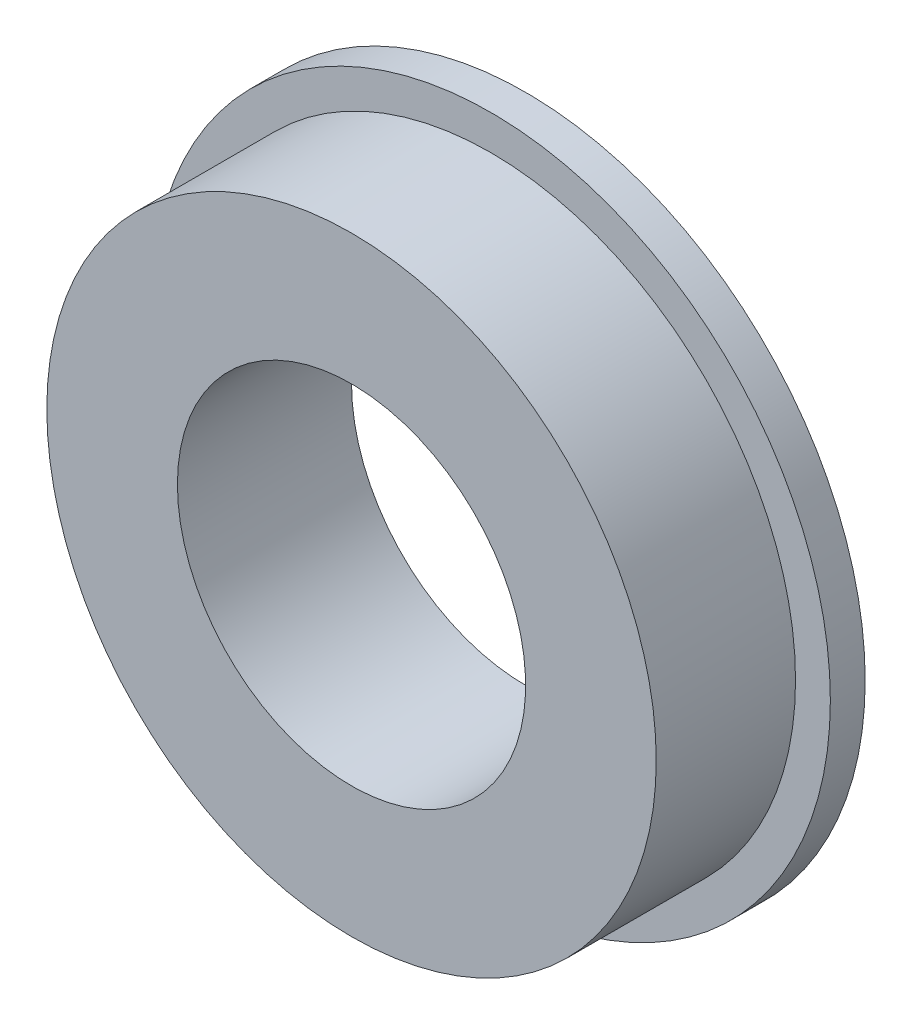
ISO-10303-21;
HEADER;
FILE_DESCRIPTION(('STEP AP214'),'2;1');
FILE_NAME('part.step','',(''),(''),'','','');
FILE_SCHEMA(('AUTOMOTIVE_DESIGN { 1 0 10303 214 1 1 1 1 }'));
ENDSEC;
DATA;
#1=APPLICATION_CONTEXT('core data for automotive mechanical design processes');
#2=APPLICATION_PROTOCOL_DEFINITION('international standard','automotive_design',2000,#1);
#3=PRODUCT_CONTEXT('',#1,'mechanical');
#4=PRODUCT('Part','Part','',(#3));
#5=PRODUCT_RELATED_PRODUCT_CATEGORY('part','',(#4));
#6=PRODUCT_DEFINITION_FORMATION('','',#4);
#7=PRODUCT_DEFINITION_CONTEXT('part definition',#1,'design');
#8=PRODUCT_DEFINITION('design','',#6,#7);
#9=PRODUCT_DEFINITION_SHAPE('','',#8);
#10=(LENGTH_UNIT() NAMED_UNIT(*) SI_UNIT(.MILLI.,.METRE.));
#11=(NAMED_UNIT(*) PLANE_ANGLE_UNIT() SI_UNIT($,.RADIAN.));
#12=(NAMED_UNIT(*) SI_UNIT($,.STERADIAN.) SOLID_ANGLE_UNIT());
#13=UNCERTAINTY_MEASURE_WITH_UNIT(LENGTH_MEASURE(1.E-05),#10,'distance_accuracy_value','');
#14=(GEOMETRIC_REPRESENTATION_CONTEXT(3) GLOBAL_UNCERTAINTY_ASSIGNED_CONTEXT((#13)) GLOBAL_UNIT_ASSIGNED_CONTEXT((#10,
#11,#12)) REPRESENTATION_CONTEXT('',''));
#15=CARTESIAN_POINT('',(0.,0.,0.));
#16=DIRECTION('',(0.,0.,1.));
#17=DIRECTION('',(1.,0.,0.));
#18=AXIS2_PLACEMENT_3D('',#15,#16,#17);
#19=CARTESIAN_POINT('',(0.,0.,0.8));
#20=DIRECTION('',(0.,0.,-1.));
#21=DIRECTION('',(-1.,0.,0.));
#22=AXIS2_PLACEMENT_3D('',#19,#20,#21);
#23=CYLINDRICAL_SURFACE('',#22,7.8);
#24=CARTESIAN_POINT('',(0.,0.,0.8));
#25=DIRECTION('',(0.,0.,1.));
#26=DIRECTION('',(1.,0.,0.));
#27=AXIS2_PLACEMENT_3D('',#24,#25,#26);
#28=CIRCLE('',#27,7.8);
#29=CARTESIAN_POINT('',(7.8,0.,0.8));
#30=VERTEX_POINT('',#29);
#31=EDGE_CURVE('E46',#30,#30,#28,.T.);
#32=ORIENTED_EDGE('',*,*,#31,.F.);
#33=EDGE_LOOP('',(#32));
#34=FACE_BOUND('',#33,.T.);
#35=CARTESIAN_POINT('',(0.,0.,0.));
#36=DIRECTION('',(0.,0.,1.));
#37=DIRECTION('',(1.,0.,0.));
#38=AXIS2_PLACEMENT_3D('',#35,#36,#37);
#39=CIRCLE('',#38,7.8);
#40=CARTESIAN_POINT('',(7.8,0.,0.));
#41=VERTEX_POINT('',#40);
#42=EDGE_CURVE('E45',#41,#41,#39,.T.);
#43=ORIENTED_EDGE('',*,*,#42,.T.);
#44=EDGE_LOOP('',(#43));
#45=FACE_BOUND('',#44,.T.);
#46=ADVANCED_FACE('F39',(#34,#45),#23,.T.);
#47=CARTESIAN_POINT('',(0.,0.,0.8));
#48=DIRECTION('',(0.,0.,1.));
#49=DIRECTION('',(1.,0.,0.));
#50=AXIS2_PLACEMENT_3D('',#47,#48,#49);
#51=PLANE('',#50);
#52=CARTESIAN_POINT('',(0.,0.,0.8));
#53=DIRECTION('',(0.,0.,1.));
#54=DIRECTION('',(1.,0.,0.));
#55=AXIS2_PLACEMENT_3D('',#52,#53,#54);
#56=CIRCLE('',#55,7.);
#57=CARTESIAN_POINT('',(7.,0.,0.8));
#58=VERTEX_POINT('',#57);
#59=EDGE_CURVE('E10',#58,#58,#56,.T.);
#60=ORIENTED_EDGE('',*,*,#59,.F.);
#61=EDGE_LOOP('',(#60));
#62=FACE_BOUND('',#61,.T.);
#63=ORIENTED_EDGE('',*,*,#31,.T.);
#64=EDGE_LOOP('',(#63));
#65=FACE_BOUND('',#64,.T.);
#66=ADVANCED_FACE('F73',(#62,#65),#51,.T.);
#67=CARTESIAN_POINT('',(0.,0.,0.));
#68=DIRECTION('',(0.,0.,1.));
#69=DIRECTION('',(1.,0.,0.));
#70=AXIS2_PLACEMENT_3D('',#67,#68,#69);
#71=PLANE('',#70);
#72=CARTESIAN_POINT('',(0.,0.,0.));
#73=DIRECTION('',(0.,0.,-1.));
#74=DIRECTION('',(-1.,0.,0.));
#75=AXIS2_PLACEMENT_3D('',#72,#73,#74);
#76=CIRCLE('',#75,4.);
#77=CARTESIAN_POINT('',(-4.,0.,0.));
#78=VERTEX_POINT('',#77);
#79=EDGE_CURVE('E57',#78,#78,#76,.T.);
#80=ORIENTED_EDGE('',*,*,#79,.F.);
#81=EDGE_LOOP('',(#80));
#82=FACE_BOUND('',#81,.T.);
#83=ORIENTED_EDGE('',*,*,#42,.F.);
#84=EDGE_LOOP('',(#83));
#85=FACE_BOUND('',#84,.T.);
#86=ADVANCED_FACE('F72',(#82,#85),#71,.F.);
#87=CARTESIAN_POINT('',(0.,0.,4.));
#88=DIRECTION('',(0.,0.,-1.));
#89=DIRECTION('',(-1.,0.,0.));
#90=AXIS2_PLACEMENT_3D('',#87,#88,#89);
#91=CYLINDRICAL_SURFACE('',#90,7.);
#92=CARTESIAN_POINT('',(0.,0.,4.));
#93=DIRECTION('',(0.,0.,1.));
#94=DIRECTION('',(1.,0.,0.));
#95=AXIS2_PLACEMENT_3D('',#92,#93,#94);
#96=CIRCLE('',#95,7.);
#97=CARTESIAN_POINT('',(7.,0.,4.));
#98=VERTEX_POINT('',#97);
#99=EDGE_CURVE('E55',#98,#98,#96,.T.);
#100=ORIENTED_EDGE('',*,*,#99,.F.);
#101=EDGE_LOOP('',(#100));
#102=FACE_BOUND('',#101,.T.);
#103=ORIENTED_EDGE('',*,*,#59,.T.);
#104=EDGE_LOOP('',(#103));
#105=FACE_BOUND('',#104,.T.);
#106=ADVANCED_FACE('F74',(#102,#105),#91,.T.);
#107=CARTESIAN_POINT('',(0.,0.,4.));
#108=DIRECTION('',(0.,0.,1.));
#109=DIRECTION('',(1.,0.,0.));
#110=AXIS2_PLACEMENT_3D('',#107,#108,#109);
#111=PLANE('',#110);
#112=CARTESIAN_POINT('',(0.,0.,4.));
#113=DIRECTION('',(0.,0.,-1.));
#114=DIRECTION('',(-1.,0.,0.));
#115=AXIS2_PLACEMENT_3D('',#112,#113,#114);
#116=CIRCLE('',#115,4.);
#117=CARTESIAN_POINT('',(-4.,0.,4.));
#118=VERTEX_POINT('',#117);
#119=EDGE_CURVE('E54',#118,#118,#116,.T.);
#120=ORIENTED_EDGE('',*,*,#119,.T.);
#121=EDGE_LOOP('',(#120));
#122=FACE_BOUND('',#121,.T.);
#123=ORIENTED_EDGE('',*,*,#99,.T.);
#124=EDGE_LOOP('',(#123));
#125=FACE_BOUND('',#124,.T.);
#126=ADVANCED_FACE('F64',(#122,#125),#111,.T.);
#127=CARTESIAN_POINT('',(0.,0.,4.));
#128=DIRECTION('',(0.,0.,-1.));
#129=DIRECTION('',(-1.,0.,0.));
#130=AXIS2_PLACEMENT_3D('',#127,#128,#129);
#131=CYLINDRICAL_SURFACE('',#130,4.);
#132=ORIENTED_EDGE('',*,*,#119,.F.);
#133=EDGE_LOOP('',(#132));
#134=FACE_BOUND('',#133,.T.);
#135=ORIENTED_EDGE('',*,*,#79,.T.);
#136=EDGE_LOOP('',(#135));
#137=FACE_BOUND('',#136,.T.);
#138=ADVANCED_FACE('F61',(#134,#137),#131,.F.);
#139=CLOSED_SHELL('',(#46,#66,#86,#106,#126,#138));
#140=MANIFOLD_SOLID_BREP('B2',#139);
#141=ADVANCED_BREP_SHAPE_REPRESENTATION('',(#18,#140),#14);
#142=SHAPE_DEFINITION_REPRESENTATION(#9,#141);
ENDSEC;
END-ISO-10303-21;
